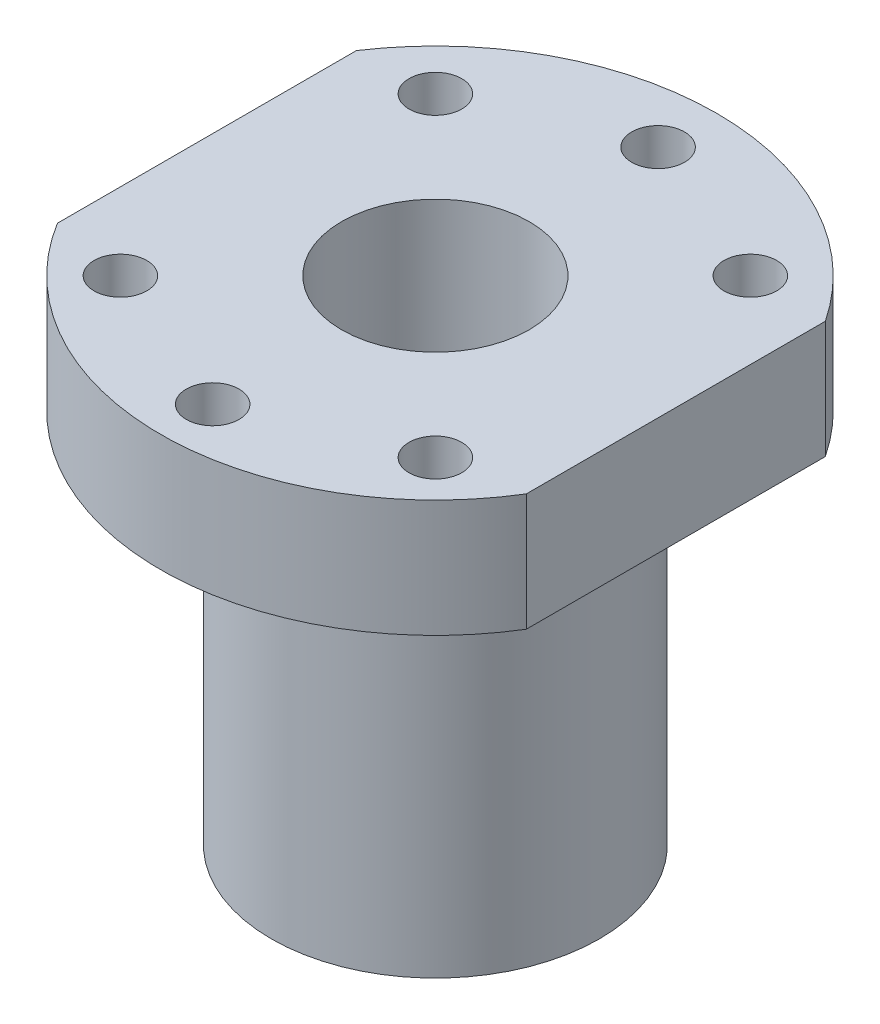
ISO-10303-21;
HEADER;
FILE_DESCRIPTION(('STEP AP214'),'2;1');
FILE_NAME('part.step','',(''),(''),'','','');
FILE_SCHEMA(('AUTOMOTIVE_DESIGN { 1 0 10303 214 1 1 1 1 }'));
ENDSEC;
DATA;
#1=APPLICATION_CONTEXT('core data for automotive mechanical design processes');
#2=APPLICATION_PROTOCOL_DEFINITION('international standard','automotive_design',2000,#1);
#3=PRODUCT_CONTEXT('',#1,'mechanical');
#4=PRODUCT('Part','Part','',(#3));
#5=PRODUCT_RELATED_PRODUCT_CATEGORY('part','',(#4));
#6=PRODUCT_DEFINITION_FORMATION('','',#4);
#7=PRODUCT_DEFINITION_CONTEXT('part definition',#1,'design');
#8=PRODUCT_DEFINITION('design','',#6,#7);
#9=PRODUCT_DEFINITION_SHAPE('','',#8);
#10=(LENGTH_UNIT() NAMED_UNIT(*) SI_UNIT(.MILLI.,.METRE.));
#11=(NAMED_UNIT(*) PLANE_ANGLE_UNIT() SI_UNIT($,.RADIAN.));
#12=(NAMED_UNIT(*) SI_UNIT($,.STERADIAN.) SOLID_ANGLE_UNIT());
#13=UNCERTAINTY_MEASURE_WITH_UNIT(LENGTH_MEASURE(1.E-05),#10,'distance_accuracy_value','');
#14=(GEOMETRIC_REPRESENTATION_CONTEXT(3) GLOBAL_UNCERTAINTY_ASSIGNED_CONTEXT((#13)) GLOBAL_UNIT_ASSIGNED_CONTEXT((#10,
#11,#12)) REPRESENTATION_CONTEXT('',''));
#15=CARTESIAN_POINT('',(0.,0.,0.));
#16=DIRECTION('',(0.,0.,1.));
#17=DIRECTION('',(1.,0.,0.));
#18=AXIS2_PLACEMENT_3D('',#15,#16,#17);
#19=CARTESIAN_POINT('',(-101.996680827691,0.,1.86504182793716));
#20=DIRECTION('',(0.,1.,0.));
#21=DIRECTION('',(0.,0.,1.));
#22=AXIS2_PLACEMENT_3D('',#19,#20,#21);
#23=PLANE('',#22);
#24=CARTESIAN_POINT('',(-115.431709670235,0.,15.300070670482));
#25=DIRECTION('',(0.,1.,0.));
#26=DIRECTION('',(0.,0.,1.));
#27=AXIS2_PLACEMENT_3D('',#24,#25,#26);
#28=CIRCLE('',#27,2.24999999999999);
#29=CARTESIAN_POINT('',(-115.431709670235,0.,17.550070670482));
#30=VERTEX_POINT('',#29);
#31=EDGE_CURVE('E303',#30,#30,#28,.T.);
#32=ORIENTED_EDGE('',*,*,#31,.T.);
#33=EDGE_LOOP('',(#32));
#34=FACE_BOUND('',#33,.T.);
#35=CARTESIAN_POINT('',(-101.99668082769,0.,20.8650418279375));
#36=DIRECTION('',(0.,1.,0.));
#37=DIRECTION('',(0.,0.,1.));
#38=AXIS2_PLACEMENT_3D('',#35,#36,#37);
#39=CIRCLE('',#38,2.24999999999999);
#40=CARTESIAN_POINT('',(-101.99668082769,0.,23.1150418279375));
#41=VERTEX_POINT('',#40);
#42=EDGE_CURVE('E295',#41,#41,#39,.T.);
#43=ORIENTED_EDGE('',*,*,#42,.T.);
#44=EDGE_LOOP('',(#43));
#45=FACE_BOUND('',#44,.T.);
#46=CARTESIAN_POINT('',(-115.431709670235,0.,-11.5699870146074));
#47=DIRECTION('',(0.,1.,0.));
#48=DIRECTION('',(0.,0.,-1.));
#49=AXIS2_PLACEMENT_3D('',#46,#47,#48);
#50=CIRCLE('',#49,2.25);
#51=CARTESIAN_POINT('',(-115.431709670235,0.,-13.8199870146074));
#52=VERTEX_POINT('',#51);
#53=EDGE_CURVE('E287',#52,#52,#50,.T.);
#54=ORIENTED_EDGE('',*,*,#53,.T.);
#55=EDGE_LOOP('',(#54));
#56=FACE_BOUND('',#55,.T.);
#57=CARTESIAN_POINT('',(-101.996680827691,0.,1.86504182793716));
#58=DIRECTION('',(0.,1.,0.));
#59=DIRECTION('',(0.,0.,1.));
#60=AXIS2_PLACEMENT_3D('',#57,#58,#59);
#61=CIRCLE('',#60,24.);
#62=CARTESIAN_POINT('',(-81.9966808276908,0.,-11.4014573334844));
#63=VERTEX_POINT('',#62);
#64=CARTESIAN_POINT('',(-121.996680827691,0.,-11.4014573334845));
#65=VERTEX_POINT('',#64);
#66=EDGE_CURVE('E101',#63,#65,#61,.T.);
#67=ORIENTED_EDGE('',*,*,#66,.F.);
#68=DIRECTION('',(0.,0.,-1.));
#69=VECTOR('',#68,1.);
#70=CARTESIAN_POINT('',(-81.9966808276908,0.,-11.4014573334844));
#71=LINE('',#70,#69);
#72=CARTESIAN_POINT('',(-81.9966808276908,0.,14.1055365967544));
#73=VERTEX_POINT('',#72);
#74=EDGE_CURVE('E73',#73,#63,#71,.T.);
#75=ORIENTED_EDGE('',*,*,#74,.F.);
#76=CARTESIAN_POINT('',(-101.996680827691,0.,1.86504182793716));
#77=DIRECTION('',(0.,1.,0.));
#78=DIRECTION('',(0.,0.,-1.));
#79=AXIS2_PLACEMENT_3D('',#76,#77,#78);
#80=CIRCLE('',#79,23.4484479696513);
#81=CARTESIAN_POINT('',(-121.996680827691,0.,14.1055365967545));
#82=VERTEX_POINT('',#81);
#83=EDGE_CURVE('E67',#82,#73,#80,.T.);
#84=ORIENTED_EDGE('',*,*,#83,.F.);
#85=DIRECTION('',(0.,0.,1.));
#86=VECTOR('',#85,1.);
#87=CARTESIAN_POINT('',(-121.996680827691,0.,-11.4014573334845));
#88=LINE('',#87,#86);
#89=EDGE_CURVE('E92',#65,#82,#88,.T.);
#90=ORIENTED_EDGE('',*,*,#89,.F.);
#91=EDGE_LOOP('',(#67,#75,#84,#90));
#92=FACE_BOUND('',#91,.T.);
#93=CARTESIAN_POINT('',(-101.996680827691,0.,-17.1349581720628));
#94=DIRECTION('',(0.,1.,0.));
#95=DIRECTION('',(0.,0.,1.));
#96=AXIS2_PLACEMENT_3D('',#93,#94,#95);
#97=CIRCLE('',#96,2.25);
#98=CARTESIAN_POINT('',(-101.996680827691,0.,-14.8849581720628));
#99=VERTEX_POINT('',#98);
#100=EDGE_CURVE('E119',#99,#99,#97,.T.);
#101=ORIENTED_EDGE('',*,*,#100,.T.);
#102=EDGE_LOOP('',(#101));
#103=FACE_BOUND('',#102,.T.);
#104=CARTESIAN_POINT('',(-88.5616519851463,0.,-11.5699870146074));
#105=DIRECTION('',(0.,1.,0.));
#106=DIRECTION('',(0.,0.,1.));
#107=AXIS2_PLACEMENT_3D('',#104,#105,#106);
#108=CIRCLE('',#107,2.25);
#109=CARTESIAN_POINT('',(-88.5616519851463,0.,-9.31998701460739));
#110=VERTEX_POINT('',#109);
#111=EDGE_CURVE('E123',#110,#110,#108,.T.);
#112=ORIENTED_EDGE('',*,*,#111,.T.);
#113=EDGE_LOOP('',(#112));
#114=FACE_BOUND('',#113,.T.);
#115=CARTESIAN_POINT('',(-88.5616519851455,0.,15.3000706704822));
#116=DIRECTION('',(0.,1.,0.));
#117=DIRECTION('',(0.,0.,-1.));
#118=AXIS2_PLACEMENT_3D('',#115,#116,#117);
#119=CIRCLE('',#118,2.25000000000001);
#120=CARTESIAN_POINT('',(-88.5616519851455,0.,13.0500706704822));
#121=VERTEX_POINT('',#120);
#122=EDGE_CURVE('E127',#121,#121,#119,.T.);
#123=ORIENTED_EDGE('',*,*,#122,.T.);
#124=EDGE_LOOP('',(#123));
#125=FACE_BOUND('',#124,.T.);
#126=CARTESIAN_POINT('',(-101.996680827691,0.,1.86504182793716));
#127=DIRECTION('',(0.,1.,0.));
#128=DIRECTION('',(0.,0.,1.));
#129=AXIS2_PLACEMENT_3D('',#126,#127,#128);
#130=CIRCLE('',#129,14.);
#131=CARTESIAN_POINT('',(-101.996680827691,0.,15.8650418279372));
#132=VERTEX_POINT('',#131);
#133=EDGE_CURVE('E11',#132,#132,#130,.F.);
#134=ORIENTED_EDGE('',*,*,#133,.F.);
#135=EDGE_LOOP('',(#134));
#136=FACE_BOUND('',#135,.T.);
#137=ADVANCED_FACE('F33',(#34,#45,#56,#92,#103,#114,#125,#136),#23,.F.);
#138=CARTESIAN_POINT('',(-101.996680827691,10.,1.86504182793716));
#139=DIRECTION('',(0.,1.,0.));
#140=DIRECTION('',(0.,0.,1.));
#141=AXIS2_PLACEMENT_3D('',#138,#139,#140);
#142=PLANE('',#141);
#143=CARTESIAN_POINT('',(-88.5616519851455,10.,15.3000706704822));
#144=DIRECTION('',(0.,1.,0.));
#145=DIRECTION('',(0.,0.,-1.));
#146=AXIS2_PLACEMENT_3D('',#143,#144,#145);
#147=CIRCLE('',#146,2.25000000000001);
#148=CARTESIAN_POINT('',(-88.5616519851455,10.,13.0500706704822));
#149=VERTEX_POINT('',#148);
#150=EDGE_CURVE('E273',#149,#149,#147,.T.);
#151=ORIENTED_EDGE('',*,*,#150,.F.);
#152=EDGE_LOOP('',(#151));
#153=FACE_BOUND('',#152,.T.);
#154=CARTESIAN_POINT('',(-88.5616519851463,10.,-11.5699870146074));
#155=DIRECTION('',(0.,1.,0.));
#156=DIRECTION('',(0.,0.,1.));
#157=AXIS2_PLACEMENT_3D('',#154,#155,#156);
#158=CIRCLE('',#157,2.25);
#159=CARTESIAN_POINT('',(-88.5616519851463,10.,-9.31998701460739));
#160=VERTEX_POINT('',#159);
#161=EDGE_CURVE('E277',#160,#160,#158,.T.);
#162=ORIENTED_EDGE('',*,*,#161,.F.);
#163=EDGE_LOOP('',(#162));
#164=FACE_BOUND('',#163,.T.);
#165=CARTESIAN_POINT('',(-101.996680827691,10.,-17.1349581720628));
#166=DIRECTION('',(0.,1.,0.));
#167=DIRECTION('',(0.,0.,1.));
#168=AXIS2_PLACEMENT_3D('',#165,#166,#167);
#169=CIRCLE('',#168,2.25);
#170=CARTESIAN_POINT('',(-101.996680827691,10.,-14.8849581720628));
#171=VERTEX_POINT('',#170);
#172=EDGE_CURVE('E280',#171,#171,#169,.T.);
#173=ORIENTED_EDGE('',*,*,#172,.F.);
#174=EDGE_LOOP('',(#173));
#175=FACE_BOUND('',#174,.T.);
#176=CARTESIAN_POINT('',(-101.996680827691,10.,1.86504182793716));
#177=DIRECTION('',(0.,1.,0.));
#178=DIRECTION('',(0.,0.,1.));
#179=AXIS2_PLACEMENT_3D('',#176,#177,#178);
#180=CIRCLE('',#179,24.);
#181=CARTESIAN_POINT('',(-81.9966808276908,10.,-11.4014573334844));
#182=VERTEX_POINT('',#181);
#183=CARTESIAN_POINT('',(-121.996680827691,10.,-11.4014573334845));
#184=VERTEX_POINT('',#183);
#185=EDGE_CURVE('E87',#182,#184,#180,.T.);
#186=ORIENTED_EDGE('',*,*,#185,.T.);
#187=DIRECTION('',(0.,0.,1.));
#188=VECTOR('',#187,1.);
#189=CARTESIAN_POINT('',(-121.996680827691,10.,-11.4014573334845));
#190=LINE('',#189,#188);
#191=CARTESIAN_POINT('',(-121.996680827691,10.,14.1055365967545));
#192=VERTEX_POINT('',#191);
#193=EDGE_CURVE('E81',#184,#192,#190,.T.);
#194=ORIENTED_EDGE('',*,*,#193,.T.);
#195=CARTESIAN_POINT('',(-101.996680827691,10.,1.86504182793716));
#196=DIRECTION('',(0.,1.,0.));
#197=DIRECTION('',(0.,0.,-1.));
#198=AXIS2_PLACEMENT_3D('',#195,#196,#197);
#199=CIRCLE('',#198,23.4484479696513);
#200=CARTESIAN_POINT('',(-81.9966808276908,10.,14.1055365967544));
#201=VERTEX_POINT('',#200);
#202=EDGE_CURVE('E85',#192,#201,#199,.T.);
#203=ORIENTED_EDGE('',*,*,#202,.T.);
#204=DIRECTION('',(0.,0.,-1.));
#205=VECTOR('',#204,1.);
#206=CARTESIAN_POINT('',(-81.9966808276908,10.,-11.4014573334844));
#207=LINE('',#206,#205);
#208=EDGE_CURVE('E50',#201,#182,#207,.T.);
#209=ORIENTED_EDGE('',*,*,#208,.T.);
#210=EDGE_LOOP('',(#186,#194,#203,#209));
#211=FACE_BOUND('',#210,.T.);
#212=CARTESIAN_POINT('',(-101.996680827691,10.,1.86504182793716));
#213=DIRECTION('',(0.,1.,0.));
#214=DIRECTION('',(0.,0.,1.));
#215=AXIS2_PLACEMENT_3D('',#212,#213,#214);
#216=CIRCLE('',#215,8.);
#217=CARTESIAN_POINT('',(-101.996680827691,10.,9.86504182793716));
#218=VERTEX_POINT('',#217);
#219=EDGE_CURVE('E104',#218,#218,#216,.T.);
#220=ORIENTED_EDGE('',*,*,#219,.F.);
#221=EDGE_LOOP('',(#220));
#222=FACE_BOUND('',#221,.T.);
#223=CARTESIAN_POINT('',(-115.431709670235,10.,-11.5699870146074));
#224=DIRECTION('',(0.,1.,0.));
#225=DIRECTION('',(0.,0.,-1.));
#226=AXIS2_PLACEMENT_3D('',#223,#224,#225);
#227=CIRCLE('',#226,2.25);
#228=CARTESIAN_POINT('',(-115.431709670235,10.,-13.8199870146074));
#229=VERTEX_POINT('',#228);
#230=EDGE_CURVE('E284',#229,#229,#227,.T.);
#231=ORIENTED_EDGE('',*,*,#230,.F.);
#232=EDGE_LOOP('',(#231));
#233=FACE_BOUND('',#232,.T.);
#234=CARTESIAN_POINT('',(-101.99668082769,10.,20.8650418279375));
#235=DIRECTION('',(0.,1.,0.));
#236=DIRECTION('',(0.,0.,1.));
#237=AXIS2_PLACEMENT_3D('',#234,#235,#236);
#238=CIRCLE('',#237,2.24999999999999);
#239=CARTESIAN_POINT('',(-101.99668082769,10.,23.1150418279375));
#240=VERTEX_POINT('',#239);
#241=EDGE_CURVE('E293',#240,#240,#238,.T.);
#242=ORIENTED_EDGE('',*,*,#241,.F.);
#243=EDGE_LOOP('',(#242));
#244=FACE_BOUND('',#243,.T.);
#245=CARTESIAN_POINT('',(-115.431709670235,10.,15.300070670482));
#246=DIRECTION('',(0.,1.,0.));
#247=DIRECTION('',(0.,0.,1.));
#248=AXIS2_PLACEMENT_3D('',#245,#246,#247);
#249=CIRCLE('',#248,2.24999999999999);
#250=CARTESIAN_POINT('',(-115.431709670235,10.,17.550070670482));
#251=VERTEX_POINT('',#250);
#252=EDGE_CURVE('E301',#251,#251,#249,.T.);
#253=ORIENTED_EDGE('',*,*,#252,.F.);
#254=EDGE_LOOP('',(#253));
#255=FACE_BOUND('',#254,.T.);
#256=ADVANCED_FACE('F82',(#153,#164,#175,#211,#222,#233,#244,#255),#142,.T.);
#257=CARTESIAN_POINT('',(-101.996680827691,10.,1.86504182793716));
#258=DIRECTION('',(0.,-1.,0.));
#259=DIRECTION('',(0.,0.,-1.));
#260=AXIS2_PLACEMENT_3D('',#257,#258,#259);
#261=CYLINDRICAL_SURFACE('',#260,24.);
#262=ORIENTED_EDGE('',*,*,#66,.T.);
#263=DIRECTION('',(0.,-1.,0.));
#264=VECTOR('',#263,1.);
#265=CARTESIAN_POINT('',(-121.996680827691,10.,-11.4014573334845));
#266=LINE('',#265,#264);
#267=EDGE_CURVE('E42',#184,#65,#266,.T.);
#268=ORIENTED_EDGE('',*,*,#267,.F.);
#269=ORIENTED_EDGE('',*,*,#185,.F.);
#270=DIRECTION('',(0.,-1.,0.));
#271=VECTOR('',#270,1.);
#272=CARTESIAN_POINT('',(-81.9966808276908,10.,-11.4014573334844));
#273=LINE('',#272,#271);
#274=EDGE_CURVE('E97',#182,#63,#273,.T.);
#275=ORIENTED_EDGE('',*,*,#274,.T.);
#276=EDGE_LOOP('',(#262,#268,#269,#275));
#277=FACE_BOUND('',#276,.T.);
#278=ADVANCED_FACE('F35',(#277),#261,.T.);
#279=CARTESIAN_POINT('',(-121.996680827691,10.,-11.4014573334845));
#280=DIRECTION('',(1.,0.,0.));
#281=DIRECTION('',(0.,0.,-1.));
#282=AXIS2_PLACEMENT_3D('',#279,#280,#281);
#283=PLANE('',#282);
#284=ORIENTED_EDGE('',*,*,#89,.T.);
#285=DIRECTION('',(0.,-1.,0.));
#286=VECTOR('',#285,1.);
#287=CARTESIAN_POINT('',(-121.996680827691,10.,14.1055365967545));
#288=LINE('',#287,#286);
#289=EDGE_CURVE('E90',#192,#82,#288,.T.);
#290=ORIENTED_EDGE('',*,*,#289,.F.);
#291=ORIENTED_EDGE('',*,*,#193,.F.);
#292=ORIENTED_EDGE('',*,*,#267,.T.);
#293=EDGE_LOOP('',(#284,#290,#291,#292));
#294=FACE_BOUND('',#293,.T.);
#295=ADVANCED_FACE('F91',(#294),#283,.F.);
#296=CARTESIAN_POINT('',(-101.996680827691,10.,1.86504182793716));
#297=DIRECTION('',(0.,-1.,0.));
#298=DIRECTION('',(0.,0.,-1.));
#299=AXIS2_PLACEMENT_3D('',#296,#297,#298);
#300=CYLINDRICAL_SURFACE('',#299,23.4484479696513);
#301=ORIENTED_EDGE('',*,*,#83,.T.);
#302=DIRECTION('',(0.,-1.,0.));
#303=VECTOR('',#302,1.);
#304=CARTESIAN_POINT('',(-81.9966808276908,10.,14.1055365967544));
#305=LINE('',#304,#303);
#306=EDGE_CURVE('E93',#201,#73,#305,.T.);
#307=ORIENTED_EDGE('',*,*,#306,.F.);
#308=ORIENTED_EDGE('',*,*,#202,.F.);
#309=ORIENTED_EDGE('',*,*,#289,.T.);
#310=EDGE_LOOP('',(#301,#307,#308,#309));
#311=FACE_BOUND('',#310,.T.);
#312=ADVANCED_FACE('F95',(#311),#300,.T.);
#313=CARTESIAN_POINT('',(-81.9966808276908,10.,-11.4014573334844));
#314=DIRECTION('',(-1.,0.,0.));
#315=DIRECTION('',(0.,0.,1.));
#316=AXIS2_PLACEMENT_3D('',#313,#314,#315);
#317=PLANE('',#316);
#318=ORIENTED_EDGE('',*,*,#74,.T.);
#319=ORIENTED_EDGE('',*,*,#274,.F.);
#320=ORIENTED_EDGE('',*,*,#208,.F.);
#321=ORIENTED_EDGE('',*,*,#306,.T.);
#322=EDGE_LOOP('',(#318,#319,#320,#321));
#323=FACE_BOUND('',#322,.T.);
#324=ADVANCED_FACE('F169',(#323),#317,.F.);
#325=CARTESIAN_POINT('',(-101.996680827691,10.,1.86504182793716));
#326=DIRECTION('',(0.,-1.,0.));
#327=DIRECTION('',(0.,0.,-1.));
#328=AXIS2_PLACEMENT_3D('',#325,#326,#327);
#329=CYLINDRICAL_SURFACE('',#328,8.);
#330=ORIENTED_EDGE('',*,*,#219,.T.);
#331=EDGE_LOOP('',(#330));
#332=FACE_BOUND('',#331,.T.);
#333=CARTESIAN_POINT('',(-101.996680827691,-32.,1.86504182793716));
#334=DIRECTION('',(0.,-1.,0.));
#335=DIRECTION('',(0.,0.,-1.));
#336=AXIS2_PLACEMENT_3D('',#333,#334,#335);
#337=CIRCLE('',#336,8.);
#338=CARTESIAN_POINT('',(-101.996680827691,-32.,-6.13495817206284));
#339=VERTEX_POINT('',#338);
#340=EDGE_CURVE('E311',#339,#339,#337,.T.);
#341=ORIENTED_EDGE('',*,*,#340,.T.);
#342=EDGE_LOOP('',(#341));
#343=FACE_BOUND('',#342,.T.);
#344=ADVANCED_FACE('F165',(#332,#343),#329,.F.);
#345=CARTESIAN_POINT('',(-101.996680827691,10.,-17.1349581720628));
#346=DIRECTION('',(0.,-1.,0.));
#347=DIRECTION('',(0.,0.,-1.));
#348=AXIS2_PLACEMENT_3D('',#345,#346,#347);
#349=CYLINDRICAL_SURFACE('',#348,2.25);
#350=ORIENTED_EDGE('',*,*,#172,.T.);
#351=EDGE_LOOP('',(#350));
#352=FACE_BOUND('',#351,.T.);
#353=ORIENTED_EDGE('',*,*,#100,.F.);
#354=EDGE_LOOP('',(#353));
#355=FACE_BOUND('',#354,.T.);
#356=ADVANCED_FACE('F161',(#352,#355),#349,.F.);
#357=CARTESIAN_POINT('',(-115.431709670235,10.,-11.5699870146074));
#358=DIRECTION('',(0.,-1.,0.));
#359=DIRECTION('',(0.,0.,-1.));
#360=AXIS2_PLACEMENT_3D('',#357,#358,#359);
#361=CYLINDRICAL_SURFACE('',#360,2.25);
#362=ORIENTED_EDGE('',*,*,#230,.T.);
#363=EDGE_LOOP('',(#362));
#364=FACE_BOUND('',#363,.T.);
#365=ORIENTED_EDGE('',*,*,#53,.F.);
#366=EDGE_LOOP('',(#365));
#367=FACE_BOUND('',#366,.T.);
#368=ADVANCED_FACE('F157',(#364,#367),#361,.F.);
#369=CARTESIAN_POINT('',(-88.5616519851463,10.,-11.5699870146074));
#370=DIRECTION('',(0.,-1.,0.));
#371=DIRECTION('',(0.,0.,-1.));
#372=AXIS2_PLACEMENT_3D('',#369,#370,#371);
#373=CYLINDRICAL_SURFACE('',#372,2.25);
#374=ORIENTED_EDGE('',*,*,#161,.T.);
#375=EDGE_LOOP('',(#374));
#376=FACE_BOUND('',#375,.T.);
#377=ORIENTED_EDGE('',*,*,#111,.F.);
#378=EDGE_LOOP('',(#377));
#379=FACE_BOUND('',#378,.T.);
#380=ADVANCED_FACE('F153',(#376,#379),#373,.F.);
#381=CARTESIAN_POINT('',(-101.99668082769,10.,20.8650418279375));
#382=DIRECTION('',(0.,-1.,0.));
#383=DIRECTION('',(0.,0.,-1.));
#384=AXIS2_PLACEMENT_3D('',#381,#382,#383);
#385=CYLINDRICAL_SURFACE('',#384,2.24999999999999);
#386=ORIENTED_EDGE('',*,*,#241,.T.);
#387=EDGE_LOOP('',(#386));
#388=FACE_BOUND('',#387,.T.);
#389=ORIENTED_EDGE('',*,*,#42,.F.);
#390=EDGE_LOOP('',(#389));
#391=FACE_BOUND('',#390,.T.);
#392=ADVANCED_FACE('F149',(#388,#391),#385,.F.);
#393=CARTESIAN_POINT('',(-88.5616519851455,10.,15.3000706704822));
#394=DIRECTION('',(0.,-1.,0.));
#395=DIRECTION('',(0.,0.,-1.));
#396=AXIS2_PLACEMENT_3D('',#393,#394,#395);
#397=CYLINDRICAL_SURFACE('',#396,2.25000000000001);
#398=ORIENTED_EDGE('',*,*,#150,.T.);
#399=EDGE_LOOP('',(#398));
#400=FACE_BOUND('',#399,.T.);
#401=ORIENTED_EDGE('',*,*,#122,.F.);
#402=EDGE_LOOP('',(#401));
#403=FACE_BOUND('',#402,.T.);
#404=ADVANCED_FACE('F145',(#400,#403),#397,.F.);
#405=CARTESIAN_POINT('',(-115.431709670235,10.,15.300070670482));
#406=DIRECTION('',(0.,-1.,0.));
#407=DIRECTION('',(0.,0.,-1.));
#408=AXIS2_PLACEMENT_3D('',#405,#406,#407);
#409=CYLINDRICAL_SURFACE('',#408,2.24999999999999);
#410=ORIENTED_EDGE('',*,*,#252,.T.);
#411=EDGE_LOOP('',(#410));
#412=FACE_BOUND('',#411,.T.);
#413=ORIENTED_EDGE('',*,*,#31,.F.);
#414=EDGE_LOOP('',(#413));
#415=FACE_BOUND('',#414,.T.);
#416=ADVANCED_FACE('F138',(#412,#415),#409,.F.);
#417=CARTESIAN_POINT('',(-101.996680827691,-32.,1.86504182793716));
#418=DIRECTION('',(0.,-1.,0.));
#419=DIRECTION('',(0.,0.,-1.));
#420=AXIS2_PLACEMENT_3D('',#417,#418,#419);
#421=PLANE('',#420);
#422=CARTESIAN_POINT('',(-101.996680827691,-32.,1.86504182793716));
#423=DIRECTION('',(0.,-1.,0.));
#424=DIRECTION('',(0.,0.,-1.));
#425=AXIS2_PLACEMENT_3D('',#422,#423,#424);
#426=CIRCLE('',#425,14.);
#427=CARTESIAN_POINT('',(-101.996680827691,-32.,-12.1349581720628));
#428=VERTEX_POINT('',#427);
#429=EDGE_CURVE('E306',#428,#428,#426,.T.);
#430=ORIENTED_EDGE('',*,*,#429,.T.);
#431=EDGE_LOOP('',(#430));
#432=FACE_BOUND('',#431,.T.);
#433=ORIENTED_EDGE('',*,*,#340,.F.);
#434=EDGE_LOOP('',(#433));
#435=FACE_BOUND('',#434,.T.);
#436=ADVANCED_FACE('F132',(#432,#435),#421,.T.);
#437=CARTESIAN_POINT('',(-101.996680827691,-32.,1.86504182793716));
#438=DIRECTION('',(0.,1.,0.));
#439=DIRECTION('',(0.,0.,1.));
#440=AXIS2_PLACEMENT_3D('',#437,#438,#439);
#441=CYLINDRICAL_SURFACE('',#440,14.);
#442=ORIENTED_EDGE('',*,*,#429,.F.);
#443=EDGE_LOOP('',(#442));
#444=FACE_BOUND('',#443,.T.);
#445=ORIENTED_EDGE('',*,*,#133,.T.);
#446=EDGE_LOOP('',(#445));
#447=FACE_BOUND('',#446,.T.);
#448=ADVANCED_FACE('F130',(#444,#447),#441,.T.);
#449=CLOSED_SHELL('',(#137,#256,#278,#295,#312,#324,#344,#356,#368,#380,#392,#404,#416,#436,#448));
#450=MANIFOLD_SOLID_BREP('B2',#449);
#451=ADVANCED_BREP_SHAPE_REPRESENTATION('',(#18,#450),#14);
#452=SHAPE_DEFINITION_REPRESENTATION(#9,#451);
ENDSEC;
END-ISO-10303-21;
